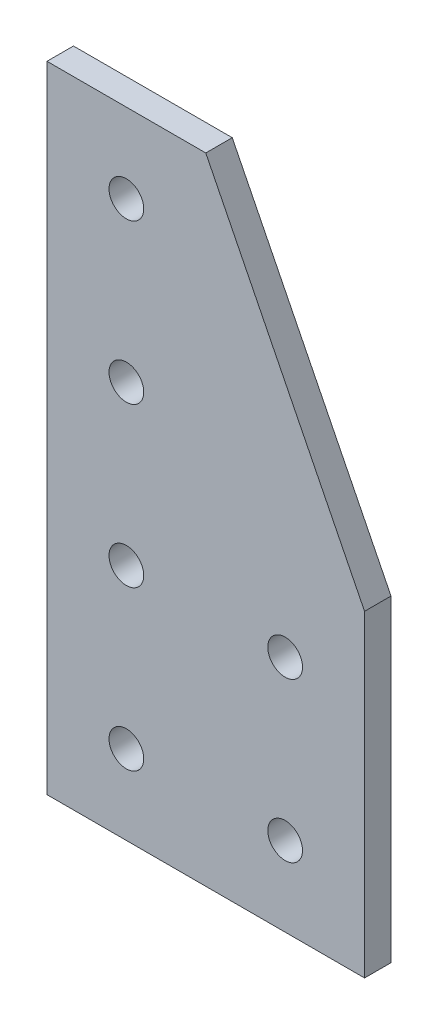
ISO-10303-21;
HEADER;
FILE_DESCRIPTION(('STEP AP214'),'2;1');
FILE_NAME('part.step','',(''),(''),'','','');
FILE_SCHEMA(('AUTOMOTIVE_DESIGN { 1 0 10303 214 1 1 1 1 }'));
ENDSEC;
DATA;
#1=APPLICATION_CONTEXT('core data for automotive mechanical design processes');
#2=APPLICATION_PROTOCOL_DEFINITION('international standard','automotive_design',2000,#1);
#3=PRODUCT_CONTEXT('',#1,'mechanical');
#4=PRODUCT('Part','Part','',(#3));
#5=PRODUCT_RELATED_PRODUCT_CATEGORY('part','',(#4));
#6=PRODUCT_DEFINITION_FORMATION('','',#4);
#7=PRODUCT_DEFINITION_CONTEXT('part definition',#1,'design');
#8=PRODUCT_DEFINITION('design','',#6,#7);
#9=PRODUCT_DEFINITION_SHAPE('','',#8);
#10=(LENGTH_UNIT() NAMED_UNIT(*) SI_UNIT(.MILLI.,.METRE.));
#11=(NAMED_UNIT(*) PLANE_ANGLE_UNIT() SI_UNIT($,.RADIAN.));
#12=(NAMED_UNIT(*) SI_UNIT($,.STERADIAN.) SOLID_ANGLE_UNIT());
#13=UNCERTAINTY_MEASURE_WITH_UNIT(LENGTH_MEASURE(1.E-05),#10,'distance_accuracy_value','');
#14=(GEOMETRIC_REPRESENTATION_CONTEXT(3) GLOBAL_UNCERTAINTY_ASSIGNED_CONTEXT((#13)) GLOBAL_UNIT_ASSIGNED_CONTEXT((#10,
#11,#12)) REPRESENTATION_CONTEXT('',''));
#15=CARTESIAN_POINT('',(0.,0.,0.));
#16=DIRECTION('',(0.,0.,1.));
#17=DIRECTION('',(1.,0.,0.));
#18=AXIS2_PLACEMENT_3D('',#15,#16,#17);
#19=CARTESIAN_POINT('',(38.1,0.,3.175));
#20=DIRECTION('',(-0.894427190999916,-0.447213595499958,0.));
#21=DIRECTION('',(0.447213595499958,-0.894427190999916,0.));
#22=AXIS2_PLACEMENT_3D('',#19,#20,#21);
#23=PLANE('',#22);
#24=DIRECTION('',(0.,0.,-1.));
#25=VECTOR('',#24,1.);
#26=CARTESIAN_POINT('',(38.1,0.,3.175));
#27=LINE('',#26,#25);
#28=CARTESIAN_POINT('',(38.1,0.,3.175));
#29=VERTEX_POINT('',#28);
#30=CARTESIAN_POINT('',(38.1,0.,-3.175));
#31=VERTEX_POINT('',#30);
#32=EDGE_CURVE('E96',#29,#31,#27,.T.);
#33=ORIENTED_EDGE('',*,*,#32,.T.);
#34=DIRECTION('',(-0.447213595499958,0.894427190999916,0.));
#35=VECTOR('',#34,1.);
#36=CARTESIAN_POINT('',(38.1,0.,-3.175));
#37=LINE('',#36,#35);
#38=CARTESIAN_POINT('',(0.,76.2,-3.175));
#39=VERTEX_POINT('',#38);
#40=EDGE_CURVE('E90',#31,#39,#37,.T.);
#41=ORIENTED_EDGE('',*,*,#40,.T.);
#42=DIRECTION('',(0.,0.,-1.));
#43=VECTOR('',#42,1.);
#44=CARTESIAN_POINT('',(0.,76.2,3.175));
#45=LINE('',#44,#43);
#46=CARTESIAN_POINT('',(0.,76.2,3.175));
#47=VERTEX_POINT('',#46);
#48=EDGE_CURVE('E11',#47,#39,#45,.T.);
#49=ORIENTED_EDGE('',*,*,#48,.F.);
#50=DIRECTION('',(-0.447213595499958,0.894427190999916,0.));
#51=VECTOR('',#50,1.);
#52=CARTESIAN_POINT('',(38.1,0.,3.175));
#53=LINE('',#52,#51);
#54=EDGE_CURVE('E110',#29,#47,#53,.T.);
#55=ORIENTED_EDGE('',*,*,#54,.F.);
#56=EDGE_LOOP('',(#33,#41,#49,#55));
#57=FACE_BOUND('',#56,.T.);
#58=ADVANCED_FACE('F32',(#57),#23,.F.);
#59=CARTESIAN_POINT('',(0.,76.2,3.175));
#60=DIRECTION('',(0.,-1.,0.));
#61=DIRECTION('',(0.,0.,-1.));
#62=AXIS2_PLACEMENT_3D('',#59,#60,#61);
#63=PLANE('',#62);
#64=ORIENTED_EDGE('',*,*,#48,.T.);
#65=DIRECTION('',(-1.,0.,0.));
#66=VECTOR('',#65,1.);
#67=CARTESIAN_POINT('',(0.,76.2,-3.175));
#68=LINE('',#67,#66);
#69=CARTESIAN_POINT('',(-38.1,76.2,-3.175));
#70=VERTEX_POINT('',#69);
#71=EDGE_CURVE('E80',#39,#70,#68,.T.);
#72=ORIENTED_EDGE('',*,*,#71,.T.);
#73=DIRECTION('',(0.,0.,-1.));
#74=VECTOR('',#73,1.);
#75=CARTESIAN_POINT('',(-38.1,76.2,3.175));
#76=LINE('',#75,#74);
#77=CARTESIAN_POINT('',(-38.1,76.2,3.175));
#78=VERTEX_POINT('',#77);
#79=EDGE_CURVE('E39',#78,#70,#76,.T.);
#80=ORIENTED_EDGE('',*,*,#79,.F.);
#81=DIRECTION('',(-1.,0.,0.));
#82=VECTOR('',#81,1.);
#83=CARTESIAN_POINT('',(0.,76.2,3.175));
#84=LINE('',#83,#82);
#85=EDGE_CURVE('E81',#47,#78,#84,.T.);
#86=ORIENTED_EDGE('',*,*,#85,.F.);
#87=EDGE_LOOP('',(#64,#72,#80,#86));
#88=FACE_BOUND('',#87,.T.);
#89=ADVANCED_FACE('F78',(#88),#63,.F.);
#90=CARTESIAN_POINT('',(-38.1,76.2,3.175));
#91=DIRECTION('',(1.,0.,0.));
#92=DIRECTION('',(0.,0.,-1.));
#93=AXIS2_PLACEMENT_3D('',#90,#91,#92);
#94=PLANE('',#93);
#95=ORIENTED_EDGE('',*,*,#79,.T.);
#96=DIRECTION('',(0.,-1.,0.));
#97=VECTOR('',#96,1.);
#98=CARTESIAN_POINT('',(-38.1,76.2,-3.175));
#99=LINE('',#98,#97);
#100=CARTESIAN_POINT('',(-38.1,-76.2,-3.175));
#101=VERTEX_POINT('',#100);
#102=EDGE_CURVE('E94',#70,#101,#99,.T.);
#103=ORIENTED_EDGE('',*,*,#102,.T.);
#104=DIRECTION('',(0.,0.,-1.));
#105=VECTOR('',#104,1.);
#106=CARTESIAN_POINT('',(-38.1,-76.2,3.175));
#107=LINE('',#106,#105);
#108=CARTESIAN_POINT('',(-38.1,-76.2,3.175));
#109=VERTEX_POINT('',#108);
#110=EDGE_CURVE('E120',#109,#101,#107,.T.);
#111=ORIENTED_EDGE('',*,*,#110,.F.);
#112=DIRECTION('',(0.,-1.,0.));
#113=VECTOR('',#112,1.);
#114=CARTESIAN_POINT('',(-38.1,76.2,3.175));
#115=LINE('',#114,#113);
#116=EDGE_CURVE('E113',#78,#109,#115,.T.);
#117=ORIENTED_EDGE('',*,*,#116,.F.);
#118=EDGE_LOOP('',(#95,#103,#111,#117));
#119=FACE_BOUND('',#118,.T.);
#120=ADVANCED_FACE('F123',(#119),#94,.F.);
#121=CARTESIAN_POINT('',(-38.1,-76.2,3.175));
#122=DIRECTION('',(0.,1.,0.));
#123=DIRECTION('',(-1.,0.,0.));
#124=AXIS2_PLACEMENT_3D('',#121,#122,#123);
#125=PLANE('',#124);
#126=ORIENTED_EDGE('',*,*,#110,.T.);
#127=DIRECTION('',(1.,0.,0.));
#128=VECTOR('',#127,1.);
#129=CARTESIAN_POINT('',(-38.1,-76.2,-3.175));
#130=LINE('',#129,#128);
#131=CARTESIAN_POINT('',(38.1,-76.2,-3.175));
#132=VERTEX_POINT('',#131);
#133=EDGE_CURVE('E105',#101,#132,#130,.T.);
#134=ORIENTED_EDGE('',*,*,#133,.T.);
#135=DIRECTION('',(0.,0.,-1.));
#136=VECTOR('',#135,1.);
#137=CARTESIAN_POINT('',(38.1,-76.2,3.175));
#138=LINE('',#137,#136);
#139=CARTESIAN_POINT('',(38.1,-76.2,3.175));
#140=VERTEX_POINT('',#139);
#141=EDGE_CURVE('E118',#140,#132,#138,.T.);
#142=ORIENTED_EDGE('',*,*,#141,.F.);
#143=DIRECTION('',(1.,0.,0.));
#144=VECTOR('',#143,1.);
#145=CARTESIAN_POINT('',(-38.1,-76.2,3.175));
#146=LINE('',#145,#144);
#147=EDGE_CURVE('E51',#109,#140,#146,.T.);
#148=ORIENTED_EDGE('',*,*,#147,.F.);
#149=EDGE_LOOP('',(#126,#134,#142,#148));
#150=FACE_BOUND('',#149,.T.);
#151=ADVANCED_FACE('F137',(#150),#125,.F.);
#152=CARTESIAN_POINT('',(38.1,-76.2,3.175));
#153=DIRECTION('',(-1.,0.,0.));
#154=DIRECTION('',(0.,0.,1.));
#155=AXIS2_PLACEMENT_3D('',#152,#153,#154);
#156=PLANE('',#155);
#157=ORIENTED_EDGE('',*,*,#141,.T.);
#158=DIRECTION('',(0.,1.,0.));
#159=VECTOR('',#158,1.);
#160=CARTESIAN_POINT('',(38.1,-76.2,-3.175));
#161=LINE('',#160,#159);
#162=EDGE_CURVE('E108',#132,#31,#161,.T.);
#163=ORIENTED_EDGE('',*,*,#162,.T.);
#164=ORIENTED_EDGE('',*,*,#32,.F.);
#165=DIRECTION('',(0.,1.,0.));
#166=VECTOR('',#165,1.);
#167=CARTESIAN_POINT('',(38.1,-76.2,3.175));
#168=LINE('',#167,#166);
#169=EDGE_CURVE('E46',#140,#29,#168,.T.);
#170=ORIENTED_EDGE('',*,*,#169,.F.);
#171=EDGE_LOOP('',(#157,#163,#164,#170));
#172=FACE_BOUND('',#171,.T.);
#173=ADVANCED_FACE('F127',(#172),#156,.F.);
#174=CARTESIAN_POINT('',(0.,0.,3.175));
#175=DIRECTION('',(0.,0.,1.));
#176=DIRECTION('',(1.,0.,0.));
#177=AXIS2_PLACEMENT_3D('',#174,#175,#176);
#178=PLANE('',#177);
#179=CARTESIAN_POINT('',(-19.0500000000004,57.15,3.175));
#180=DIRECTION('',(0.,0.,1.));
#181=DIRECTION('',(1.,0.,0.));
#182=AXIS2_PLACEMENT_3D('',#179,#180,#181);
#183=CIRCLE('',#182,4.1656);
#184=CARTESIAN_POINT('',(-14.8844000000004,57.15,3.175));
#185=VERTEX_POINT('',#184);
#186=EDGE_CURVE('E239',#185,#185,#183,.T.);
#187=ORIENTED_EDGE('',*,*,#186,.F.);
#188=EDGE_LOOP('',(#187));
#189=FACE_BOUND('',#188,.T.);
#190=CARTESIAN_POINT('',(-19.0500000000003,19.05,3.175));
#191=DIRECTION('',(0.,0.,1.));
#192=DIRECTION('',(1.,0.,0.));
#193=AXIS2_PLACEMENT_3D('',#190,#191,#192);
#194=CIRCLE('',#193,4.1656);
#195=CARTESIAN_POINT('',(-14.8844000000003,19.05,3.175));
#196=VERTEX_POINT('',#195);
#197=EDGE_CURVE('E241',#196,#196,#194,.T.);
#198=ORIENTED_EDGE('',*,*,#197,.F.);
#199=EDGE_LOOP('',(#198));
#200=FACE_BOUND('',#199,.T.);
#201=CARTESIAN_POINT('',(-19.0500000000001,-19.05,3.175));
#202=DIRECTION('',(0.,0.,1.));
#203=DIRECTION('',(1.,0.,0.));
#204=AXIS2_PLACEMENT_3D('',#201,#202,#203);
#205=CIRCLE('',#204,4.1656);
#206=CARTESIAN_POINT('',(-14.8844000000001,-19.05,3.175));
#207=VERTEX_POINT('',#206);
#208=EDGE_CURVE('E249',#207,#207,#205,.T.);
#209=ORIENTED_EDGE('',*,*,#208,.F.);
#210=EDGE_LOOP('',(#209));
#211=FACE_BOUND('',#210,.T.);
#212=CARTESIAN_POINT('',(19.0499999999999,-19.05,3.175));
#213=DIRECTION('',(0.,0.,1.));
#214=DIRECTION('',(1.,0.,0.));
#215=AXIS2_PLACEMENT_3D('',#212,#213,#214);
#216=CIRCLE('',#215,4.1656);
#217=CARTESIAN_POINT('',(23.2155999999999,-19.05,3.175));
#218=VERTEX_POINT('',#217);
#219=EDGE_CURVE('E255',#218,#218,#216,.T.);
#220=ORIENTED_EDGE('',*,*,#219,.F.);
#221=EDGE_LOOP('',(#220));
#222=FACE_BOUND('',#221,.T.);
#223=CARTESIAN_POINT('',(19.05,-57.15,3.175));
#224=DIRECTION('',(0.,0.,1.));
#225=DIRECTION('',(1.,0.,0.));
#226=AXIS2_PLACEMENT_3D('',#223,#224,#225);
#227=CIRCLE('',#226,4.1656);
#228=CARTESIAN_POINT('',(23.2156,-57.15,3.175));
#229=VERTEX_POINT('',#228);
#230=EDGE_CURVE('E261',#229,#229,#227,.T.);
#231=ORIENTED_EDGE('',*,*,#230,.F.);
#232=EDGE_LOOP('',(#231));
#233=FACE_BOUND('',#232,.T.);
#234=CARTESIAN_POINT('',(-19.05,-57.15,3.175));
#235=DIRECTION('',(0.,0.,1.));
#236=DIRECTION('',(1.,0.,0.));
#237=AXIS2_PLACEMENT_3D('',#234,#235,#236);
#238=CIRCLE('',#237,4.1656);
#239=CARTESIAN_POINT('',(-14.8844,-57.15,3.175));
#240=VERTEX_POINT('',#239);
#241=EDGE_CURVE('E100',#240,#240,#238,.T.);
#242=ORIENTED_EDGE('',*,*,#241,.F.);
#243=EDGE_LOOP('',(#242));
#244=FACE_BOUND('',#243,.T.);
#245=ORIENTED_EDGE('',*,*,#54,.T.);
#246=ORIENTED_EDGE('',*,*,#85,.T.);
#247=ORIENTED_EDGE('',*,*,#116,.T.);
#248=ORIENTED_EDGE('',*,*,#147,.T.);
#249=ORIENTED_EDGE('',*,*,#169,.T.);
#250=EDGE_LOOP('',(#245,#246,#247,#248,#249));
#251=FACE_BOUND('',#250,.T.);
#252=ADVANCED_FACE('F125',(#189,#200,#211,#222,#233,#244,#251),#178,.T.);
#253=CARTESIAN_POINT('',(0.,0.,-3.175));
#254=DIRECTION('',(0.,0.,1.));
#255=DIRECTION('',(1.,0.,0.));
#256=AXIS2_PLACEMENT_3D('',#253,#254,#255);
#257=PLANE('',#256);
#258=CARTESIAN_POINT('',(-19.0500000000004,57.15,-3.175));
#259=DIRECTION('',(0.,0.,1.));
#260=DIRECTION('',(1.,0.,0.));
#261=AXIS2_PLACEMENT_3D('',#258,#259,#260);
#262=CIRCLE('',#261,4.1656);
#263=CARTESIAN_POINT('',(-14.8844000000004,57.15,-3.175));
#264=VERTEX_POINT('',#263);
#265=EDGE_CURVE('E237',#264,#264,#262,.T.);
#266=ORIENTED_EDGE('',*,*,#265,.T.);
#267=EDGE_LOOP('',(#266));
#268=FACE_BOUND('',#267,.T.);
#269=CARTESIAN_POINT('',(-19.0500000000003,19.05,-3.175));
#270=DIRECTION('',(0.,0.,1.));
#271=DIRECTION('',(1.,0.,0.));
#272=AXIS2_PLACEMENT_3D('',#269,#270,#271);
#273=CIRCLE('',#272,4.1656);
#274=CARTESIAN_POINT('',(-14.8844000000003,19.05,-3.175));
#275=VERTEX_POINT('',#274);
#276=EDGE_CURVE('E246',#275,#275,#273,.T.);
#277=ORIENTED_EDGE('',*,*,#276,.T.);
#278=EDGE_LOOP('',(#277));
#279=FACE_BOUND('',#278,.T.);
#280=CARTESIAN_POINT('',(-19.0500000000001,-19.05,-3.175));
#281=DIRECTION('',(0.,0.,1.));
#282=DIRECTION('',(1.,0.,0.));
#283=AXIS2_PLACEMENT_3D('',#280,#281,#282);
#284=CIRCLE('',#283,4.1656);
#285=CARTESIAN_POINT('',(-14.8844000000001,-19.05,-3.175));
#286=VERTEX_POINT('',#285);
#287=EDGE_CURVE('E252',#286,#286,#284,.T.);
#288=ORIENTED_EDGE('',*,*,#287,.T.);
#289=EDGE_LOOP('',(#288));
#290=FACE_BOUND('',#289,.T.);
#291=CARTESIAN_POINT('',(19.0499999999999,-19.05,-3.175));
#292=DIRECTION('',(0.,0.,1.));
#293=DIRECTION('',(1.,0.,0.));
#294=AXIS2_PLACEMENT_3D('',#291,#292,#293);
#295=CIRCLE('',#294,4.1656);
#296=CARTESIAN_POINT('',(23.2155999999999,-19.05,-3.175));
#297=VERTEX_POINT('',#296);
#298=EDGE_CURVE('E258',#297,#297,#295,.T.);
#299=ORIENTED_EDGE('',*,*,#298,.T.);
#300=EDGE_LOOP('',(#299));
#301=FACE_BOUND('',#300,.T.);
#302=CARTESIAN_POINT('',(19.05,-57.15,-3.175));
#303=DIRECTION('',(0.,0.,1.));
#304=DIRECTION('',(1.,0.,0.));
#305=AXIS2_PLACEMENT_3D('',#302,#303,#304);
#306=CIRCLE('',#305,4.1656);
#307=CARTESIAN_POINT('',(23.2156,-57.15,-3.175));
#308=VERTEX_POINT('',#307);
#309=EDGE_CURVE('E264',#308,#308,#306,.T.);
#310=ORIENTED_EDGE('',*,*,#309,.T.);
#311=EDGE_LOOP('',(#310));
#312=FACE_BOUND('',#311,.T.);
#313=CARTESIAN_POINT('',(-19.05,-57.15,-3.175));
#314=DIRECTION('',(0.,0.,1.));
#315=DIRECTION('',(1.,0.,0.));
#316=AXIS2_PLACEMENT_3D('',#313,#314,#315);
#317=CIRCLE('',#316,4.1656);
#318=CARTESIAN_POINT('',(-14.8844,-57.15,-3.175));
#319=VERTEX_POINT('',#318);
#320=EDGE_CURVE('E97',#319,#319,#317,.T.);
#321=ORIENTED_EDGE('',*,*,#320,.T.);
#322=EDGE_LOOP('',(#321));
#323=FACE_BOUND('',#322,.T.);
#324=ORIENTED_EDGE('',*,*,#40,.F.);
#325=ORIENTED_EDGE('',*,*,#162,.F.);
#326=ORIENTED_EDGE('',*,*,#133,.F.);
#327=ORIENTED_EDGE('',*,*,#102,.F.);
#328=ORIENTED_EDGE('',*,*,#71,.F.);
#329=EDGE_LOOP('',(#324,#325,#326,#327,#328));
#330=FACE_BOUND('',#329,.T.);
#331=ADVANCED_FACE('F88',(#268,#279,#290,#301,#312,#323,#330),#257,.F.);
#332=CARTESIAN_POINT('',(-19.05,-57.15,-3.175));
#333=DIRECTION('',(0.,0.,1.));
#334=DIRECTION('',(1.,0.,0.));
#335=AXIS2_PLACEMENT_3D('',#332,#333,#334);
#336=CYLINDRICAL_SURFACE('',#335,4.1656);
#337=ORIENTED_EDGE('',*,*,#320,.F.);
#338=EDGE_LOOP('',(#337));
#339=FACE_BOUND('',#338,.T.);
#340=ORIENTED_EDGE('',*,*,#241,.T.);
#341=EDGE_LOOP('',(#340));
#342=FACE_BOUND('',#341,.T.);
#343=ADVANCED_FACE('F134',(#339,#342),#336,.F.);
#344=CARTESIAN_POINT('',(19.05,-57.15,-3.175));
#345=DIRECTION('',(0.,0.,1.));
#346=DIRECTION('',(1.,0.,0.));
#347=AXIS2_PLACEMENT_3D('',#344,#345,#346);
#348=CYLINDRICAL_SURFACE('',#347,4.1656);
#349=ORIENTED_EDGE('',*,*,#309,.F.);
#350=EDGE_LOOP('',(#349));
#351=FACE_BOUND('',#350,.T.);
#352=ORIENTED_EDGE('',*,*,#230,.T.);
#353=EDGE_LOOP('',(#352));
#354=FACE_BOUND('',#353,.T.);
#355=ADVANCED_FACE('F180',(#351,#354),#348,.F.);
#356=CARTESIAN_POINT('',(19.0499999999999,-19.05,-3.175));
#357=DIRECTION('',(0.,0.,1.));
#358=DIRECTION('',(1.,0.,0.));
#359=AXIS2_PLACEMENT_3D('',#356,#357,#358);
#360=CYLINDRICAL_SURFACE('',#359,4.1656);
#361=ORIENTED_EDGE('',*,*,#298,.F.);
#362=EDGE_LOOP('',(#361));
#363=FACE_BOUND('',#362,.T.);
#364=ORIENTED_EDGE('',*,*,#219,.T.);
#365=EDGE_LOOP('',(#364));
#366=FACE_BOUND('',#365,.T.);
#367=ADVANCED_FACE('F190',(#363,#366),#360,.F.);
#368=CARTESIAN_POINT('',(-19.0500000000001,-19.05,-3.175));
#369=DIRECTION('',(0.,0.,1.));
#370=DIRECTION('',(1.,0.,0.));
#371=AXIS2_PLACEMENT_3D('',#368,#369,#370);
#372=CYLINDRICAL_SURFACE('',#371,4.1656);
#373=ORIENTED_EDGE('',*,*,#287,.F.);
#374=EDGE_LOOP('',(#373));
#375=FACE_BOUND('',#374,.T.);
#376=ORIENTED_EDGE('',*,*,#208,.T.);
#377=EDGE_LOOP('',(#376));
#378=FACE_BOUND('',#377,.T.);
#379=ADVANCED_FACE('F200',(#375,#378),#372,.F.);
#380=CARTESIAN_POINT('',(-19.0500000000003,19.05,-3.175));
#381=DIRECTION('',(0.,0.,1.));
#382=DIRECTION('',(1.,0.,0.));
#383=AXIS2_PLACEMENT_3D('',#380,#381,#382);
#384=CYLINDRICAL_SURFACE('',#383,4.1656);
#385=ORIENTED_EDGE('',*,*,#276,.F.);
#386=EDGE_LOOP('',(#385));
#387=FACE_BOUND('',#386,.T.);
#388=ORIENTED_EDGE('',*,*,#197,.T.);
#389=EDGE_LOOP('',(#388));
#390=FACE_BOUND('',#389,.T.);
#391=ADVANCED_FACE('F210',(#387,#390),#384,.F.);
#392=CARTESIAN_POINT('',(-19.0500000000004,57.15,-3.175));
#393=DIRECTION('',(0.,0.,1.));
#394=DIRECTION('',(1.,0.,0.));
#395=AXIS2_PLACEMENT_3D('',#392,#393,#394);
#396=CYLINDRICAL_SURFACE('',#395,4.1656);
#397=ORIENTED_EDGE('',*,*,#265,.F.);
#398=EDGE_LOOP('',(#397));
#399=FACE_BOUND('',#398,.T.);
#400=ORIENTED_EDGE('',*,*,#186,.T.);
#401=EDGE_LOOP('',(#400));
#402=FACE_BOUND('',#401,.T.);
#403=ADVANCED_FACE('F220',(#399,#402),#396,.F.);
#404=CLOSED_SHELL('',(#58,#89,#120,#151,#173,#252,#331,#343,#355,#367,#379,#391,#403));
#405=MANIFOLD_SOLID_BREP('B2',#404);
#406=ADVANCED_BREP_SHAPE_REPRESENTATION('',(#18,#405),#14);
#407=SHAPE_DEFINITION_REPRESENTATION(#9,#406);
ENDSEC;
END-ISO-10303-21;
